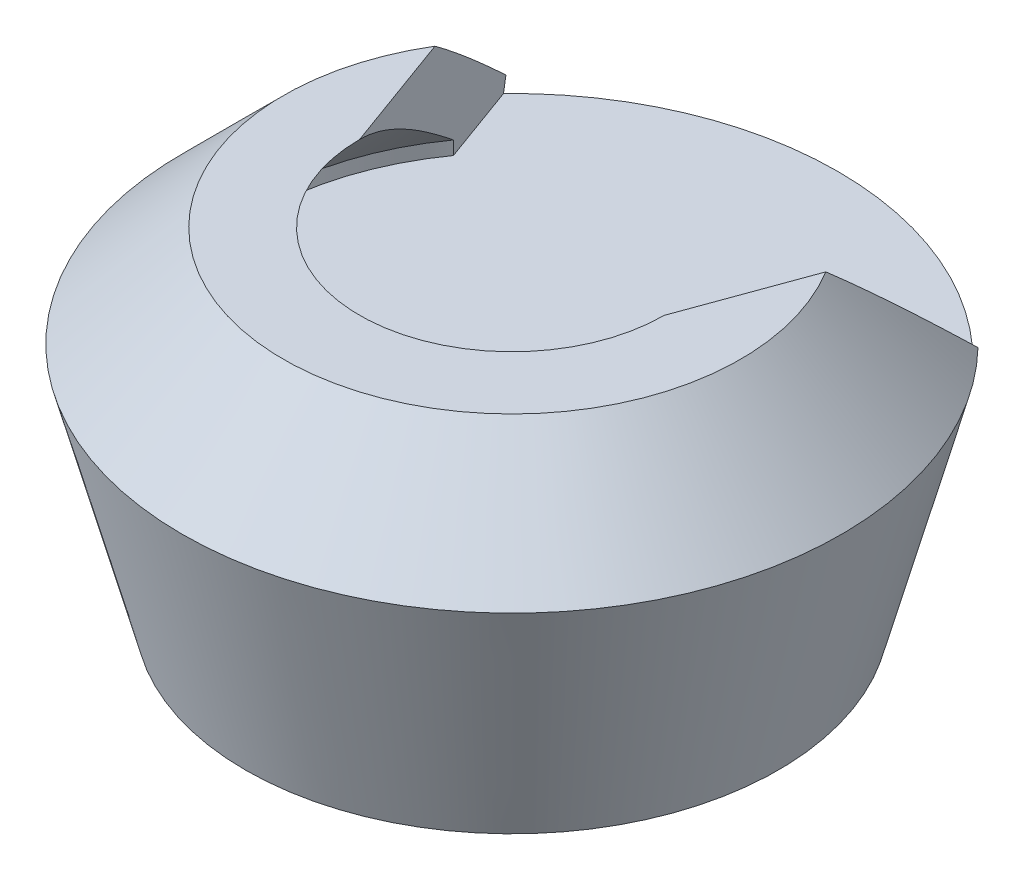
ISO-10303-21;
HEADER;
FILE_DESCRIPTION(('STEP AP214'),'2;1');
FILE_NAME('part.step','',(''),(''),'','','');
FILE_SCHEMA(('AUTOMOTIVE_DESIGN { 1 0 10303 214 1 1 1 1 }'));
ENDSEC;
DATA;
#1=APPLICATION_CONTEXT('core data for automotive mechanical design processes');
#2=APPLICATION_PROTOCOL_DEFINITION('international standard','automotive_design',2000,#1);
#3=PRODUCT_CONTEXT('',#1,'mechanical');
#4=PRODUCT('Part','Part','',(#3));
#5=PRODUCT_RELATED_PRODUCT_CATEGORY('part','',(#4));
#6=PRODUCT_DEFINITION_FORMATION('','',#4);
#7=PRODUCT_DEFINITION_CONTEXT('part definition',#1,'design');
#8=PRODUCT_DEFINITION('design','',#6,#7);
#9=PRODUCT_DEFINITION_SHAPE('','',#8);
#10=(LENGTH_UNIT() NAMED_UNIT(*) SI_UNIT(.MILLI.,.METRE.));
#11=(NAMED_UNIT(*) PLANE_ANGLE_UNIT() SI_UNIT($,.RADIAN.));
#12=(NAMED_UNIT(*) SI_UNIT($,.STERADIAN.) SOLID_ANGLE_UNIT());
#13=UNCERTAINTY_MEASURE_WITH_UNIT(LENGTH_MEASURE(1.E-05),#10,'distance_accuracy_value','');
#14=(GEOMETRIC_REPRESENTATION_CONTEXT(3) GLOBAL_UNCERTAINTY_ASSIGNED_CONTEXT((#13)) GLOBAL_UNIT_ASSIGNED_CONTEXT((#10,
#11,#12)) REPRESENTATION_CONTEXT('',''));
#15=CARTESIAN_POINT('',(0.,0.,0.));
#16=DIRECTION('',(0.,0.,1.));
#17=DIRECTION('',(1.,0.,0.));
#18=AXIS2_PLACEMENT_3D('',#15,#16,#17);
#19=CARTESIAN_POINT('',(0.,3.81,0.));
#20=DIRECTION('',(0.,-1.,0.));
#21=DIRECTION('',(0.,0.,-1.));
#22=AXIS2_PLACEMENT_3D('',#19,#20,#21);
#23=CONICAL_SURFACE('',#22,5.74310768363208,0.785398163397447);
#24=CARTESIAN_POINT('',(-5.07103692629219,4.1563517215325,1.84649923006714));
#25=CARTESIAN_POINT('',(-5.09942813403995,4.15636987535685,1.76849502786911));
#26=CARTESIAN_POINT('',(-5.12781520747056,4.15445844003045,1.6905021846141));
#27=CARTESIAN_POINT('',(-5.18452515781636,4.14683920483627,1.53469287658062));
#28=CARTESIAN_POINT('',(-5.21284804452437,4.14113202956779,1.45687638489659));
#29=CARTESIAN_POINT('',(-5.29752377616605,4.118444100905,1.22423172423527));
#30=CARTESIAN_POINT('',(-5.35371148968121,4.09589642801169,1.06985725010159));
#31=CARTESIAN_POINT('',(-5.46422625125094,4.03767333012167,0.766220438172343));
#32=CARTESIAN_POINT('',(-5.51856860477442,4.00223986881752,0.616916048946578));
#33=CARTESIAN_POINT('',(-5.6262301947838,3.91977017981424,0.321118261453221));
#34=CARTESIAN_POINT('',(-5.67954892688941,3.87272838273564,0.174626248959096));
#35=CARTESIAN_POINT('',(-5.79007504052495,3.76378096106607,-0.129041752514604));
#36=CARTESIAN_POINT('',(-5.84716712879035,3.70088452020621,-0.285900975853314));
#37=CARTESIAN_POINT('',(-5.95997917297087,3.5653060278229,-0.595849519881816));
#38=CARTESIAN_POINT('',(-6.01569873781323,3.49262122459699,-0.748937766108026));
#39=CARTESIAN_POINT('',(-6.12591950574524,3.33917234025982,-1.05176683715616));
#40=CARTESIAN_POINT('',(-6.18041863631643,3.25839562802015,-1.20150196778042));
#41=CARTESIAN_POINT('',(-6.28822084034817,3.09036754204224,-1.49768608912508));
#42=CARTESIAN_POINT('',(-6.34152405408519,3.00311693289307,-1.64413546525189));
#43=CARTESIAN_POINT('',(-6.44797403621707,2.82179749068653,-1.93660438746059));
#44=CARTESIAN_POINT('',(-6.50110259240164,2.72763767475639,-2.08257389590591));
#45=CARTESIAN_POINT('',(-6.60640358838151,2.53484512920681,-2.37188600460668));
#46=CARTESIAN_POINT('',(-6.65857595407911,2.43621205498353,-2.51522840128038));
#47=CARTESIAN_POINT('',(-6.76203700847405,2.23535631074949,-2.79948531202344));
#48=CARTESIAN_POINT('',(-6.81332643850043,2.13313689543744,-2.94040186287762));
#49=CARTESIAN_POINT('',(-6.91517805082503,1.92564330551694,-3.22023686787449));
#50=CARTESIAN_POINT('',(-6.96574020754411,1.82036902385598,-3.35915525173909));
#51=CARTESIAN_POINT('',(-7.08103177471667,1.57587697685212,-3.67591622919924));
#52=CARTESIAN_POINT('',(-7.1455467806354,1.43579582279267,-3.85316975117694));
#53=CARTESIAN_POINT('',(-7.27368364935058,1.15219026930894,-4.2052229045715));
#54=CARTESIAN_POINT('',(-7.33730550228478,1.00866583191106,-4.38002250889208));
#55=CARTESIAN_POINT('',(-7.46238692552022,0.722040728198596,-4.72368089482471));
#56=CARTESIAN_POINT('',(-7.52386309261175,0.579001839643264,-4.89258527574329));
#57=CARTESIAN_POINT('',(-7.64618612657494,0.290708889923267,-5.22866504943633));
#58=CARTESIAN_POINT('',(-7.70703311019506,0.145455252560808,-5.39584076297453));
#59=CARTESIAN_POINT('',(-7.76762257369396,-0.000699999999998335,-5.56230894579465));
#60=B_SPLINE_CURVE_WITH_KNOTS('',3,(#24,#25,#26,#27,#28,#29,#30,#31,#32,#33,#34,#35,#36,#37,#38,
#39,#40,#41,#42,#43,#44,#45,#46,#47,#48,#49,#50,#51,#52,#53,#54,#55,#56,#57,#58,#59),
.UNSPECIFIED.,.F.,.F.,(4,2,2,2,2,2,2,2,2,2,2,2,2,2,2,2,2,4),(0.,0.248985136458512,
0.49792931187136,0.994700929915593,1.48258916194823,1.97071192680393,2.50547979698101,
3.04039831604319,3.57616523119277,4.11186897087043,4.65671986661515,5.20161280726033,
5.74602342290091,6.29045313956591,6.99526593985006,7.70008651660314,8.38920675073795,
9.07819673352875),.UNSPECIFIED.);
#61=CARTESIAN_POINT('',(-5.74310768363208,3.81,0.));
#62=VERTEX_POINT('',#61);
#63=CARTESIAN_POINT('',(-7.76733243064064,0.,-5.56151178430724));
#64=VERTEX_POINT('',#63);
#65=EDGE_CURVE('E61',#62,#64,#60,.T.);
#66=ORIENTED_EDGE('',*,*,#65,.F.);
#67=CARTESIAN_POINT('',(0.,3.81,0.));
#68=DIRECTION('',(0.,-1.,0.));
#69=DIRECTION('',(0.,0.,-1.));
#70=AXIS2_PLACEMENT_3D('',#67,#68,#69);
#71=CIRCLE('',#70,5.74310768363208);
#72=CARTESIAN_POINT('',(5.74310768363208,3.81,0.));
#73=VERTEX_POINT('',#72);
#74=EDGE_CURVE('E11',#73,#62,#71,.T.);
#75=ORIENTED_EDGE('',*,*,#74,.F.);
#76=CARTESIAN_POINT('',(7.76762257369396,-0.000700000000000264,-5.56230894579465));
#77=CARTESIAN_POINT('',(7.71856681022951,0.117643676836092,-5.42752934338196));
#78=CARTESIAN_POINT('',(7.66934068161263,0.235387952292131,-5.29228166655993));
#79=CARTESIAN_POINT('',(7.57049301476131,0.469465493199715,-5.02069993392014));
#80=CARTESIAN_POINT('',(7.52087145381213,0.58579867661192,-4.88436581569418));
#81=CARTESIAN_POINT('',(7.42111056186508,0.816998062347882,-4.61027501772501));
#82=CARTESIAN_POINT('',(7.3709705764071,0.931861854074,-4.47251653986743));
#83=CARTESIAN_POINT('',(7.27018227597654,1.1596641973228,-4.19560296028925));
#84=CARTESIAN_POINT('',(7.219533969244,1.2726027799739,-4.056447881208));
#85=CARTESIAN_POINT('',(7.11581520130648,1.50025030571993,-3.771482908326));
#86=CARTESIAN_POINT('',(7.06272331114254,1.61487594802378,-3.6256141389444));
#87=CARTESIAN_POINT('',(6.95581829740996,1.84121345699558,-3.33189502768765));
#88=CARTESIAN_POINT('',(6.90200519078045,1.95292539191657,-3.18404473235239));
#89=CARTESIAN_POINT('',(6.79357089274452,2.17277756561151,-2.88612394700425));
#90=CARTESIAN_POINT('',(6.73895013487403,2.28091962658404,-2.73605464812158));
#91=CARTESIAN_POINT('',(6.62874583950862,2.49291207245634,-2.43327083507822));
#92=CARTESIAN_POINT('',(6.57316236804452,2.59676275005321,-2.2805565023357));
#93=CARTESIAN_POINT('',(6.44923725120714,2.82019072990996,-1.94007504212171));
#94=CARTESIAN_POINT('',(6.38063978128559,2.93856445220774,-1.75160504248053));
#95=CARTESIAN_POINT('',(6.24151179718698,3.16537818640374,-1.36935404775537));
#96=CARTESIAN_POINT('',(6.17098085433578,3.27381597186157,-1.17557187489886));
#97=CARTESIAN_POINT('',(6.0286943861149,3.47624657988181,-0.784643016368038));
#98=CARTESIAN_POINT('',(5.95696846938302,3.57041546383014,-0.58757767975751));
#99=CARTESIAN_POINT('',(5.81122070262597,3.74213795334608,-0.187138981656595));
#100=CARTESIAN_POINT('',(5.73720016214505,3.81970084316714,0.0162307818905612));
#101=CARTESIAN_POINT('',(5.6145838232576,3.92898455544991,0.353116404240037));
#102=CARTESIAN_POINT('',(5.5666513603291,3.96707312887542,0.484809763794928));
#103=CARTESIAN_POINT('',(5.47001884988636,4.03357612081015,0.750305404221583));
#104=CARTESIAN_POINT('',(5.42131911189537,4.06199434088126,0.884106834685185));
#105=CARTESIAN_POINT('',(5.32256250661768,4.10846623059418,1.15543837770762));
#106=CARTESIAN_POINT('',(5.27249628718579,4.12635370336416,1.29299418507419));
#107=CARTESIAN_POINT('',(5.19712343934275,4.14432357757604,1.50007938256293));
#108=CARTESIAN_POINT('',(5.17193342998384,4.14883670080695,1.5692883644724));
#109=CARTESIAN_POINT('',(5.12150887833859,4.15485809549427,1.70782868150385));
#110=CARTESIAN_POINT('',(5.09627433167398,4.1563660529196,1.77716002865505));
#111=CARTESIAN_POINT('',(5.07103692629219,4.1563517215325,1.84649923006714));
#112=B_SPLINE_CURVE_WITH_KNOTS('',3,(#76,#77,#78,#79,#80,#81,#82,#83,#84,#85,#86,#87,#88,#89,
#90,#91,#92,#93,#94,#95,#96,#97,#98,#99,#100,#101,#102,#103,#104,#105,#106,#107,#108,#109,#110,
#111),.UNSPECIFIED.,.F.,.F.,(4,2,2,2,2,2,2,2,2,2,2,2,2,2,2,2,2,4),(0.,0.557851081076562,
1.11573444102931,1.67443873784713,2.23313399247535,2.81200060596816,3.39085364742088,
3.96940650214616,4.54791983087647,5.24637810530358,5.94499250914945,6.63412601675453,
7.32287322437147,7.75826858224512,8.19349258136192,8.63541295560263,8.85672540082296,
9.07806097133646),.UNSPECIFIED.);
#113=CARTESIAN_POINT('',(7.76733243064064,0.,-5.56151178430724));
#114=VERTEX_POINT('',#113);
#115=EDGE_CURVE('E92',#114,#73,#112,.T.);
#116=ORIENTED_EDGE('',*,*,#115,.F.);
#117=CARTESIAN_POINT('',(0.,0.,0.));
#118=DIRECTION('',(0.,1.,0.));
#119=DIRECTION('',(0.,0.,1.));
#120=AXIS2_PLACEMENT_3D('',#117,#118,#119);
#121=CIRCLE('',#120,9.55310768363207);
#122=EDGE_CURVE('E112',#64,#114,#121,.T.);
#123=ORIENTED_EDGE('',*,*,#122,.F.);
#124=EDGE_LOOP('',(#66,#75,#116,#123));
#125=FACE_BOUND('',#124,.T.);
#126=ADVANCED_FACE('F39',(#125),#23,.F.);
#127=CARTESIAN_POINT('',(5.74310768363208,3.81,0.));
#128=DIRECTION('',(0.,1.,0.));
#129=DIRECTION('',(0.,0.,1.));
#130=AXIS2_PLACEMENT_3D('',#127,#128,#129);
#131=PLANE('',#130);
#132=DIRECTION('',(0.342020143325669,0.,0.939692620785908));
#133=VECTOR('',#132,1.);
#134=CARTESIAN_POINT('',(-5.74310768363208,3.81,0.));
#135=LINE('',#134,#133);
#136=CARTESIAN_POINT('',(-7.3687937685641,3.81,-4.4665358094723));
#137=VERTEX_POINT('',#136);
#138=EDGE_CURVE('E110',#137,#62,#135,.T.);
#139=ORIENTED_EDGE('',*,*,#138,.F.);
#140=CARTESIAN_POINT('',(0.,3.81,0.));
#141=DIRECTION('',(0.,-1.,0.));
#142=DIRECTION('',(0.,0.,-1.));
#143=AXIS2_PLACEMENT_3D('',#140,#141,#142);
#144=CIRCLE('',#143,8.61678964237421);
#145=CARTESIAN_POINT('',(7.3687937685641,3.81,-4.4665358094723));
#146=VERTEX_POINT('',#145);
#147=EDGE_CURVE('E47',#146,#137,#144,.T.);
#148=ORIENTED_EDGE('',*,*,#147,.F.);
#149=DIRECTION('',(0.342020143325669,0.,-0.939692620785908));
#150=VECTOR('',#149,1.);
#151=CARTESIAN_POINT('',(5.74310768363208,3.81,0.));
#152=LINE('',#151,#150);
#153=EDGE_CURVE('E95',#73,#146,#152,.T.);
#154=ORIENTED_EDGE('',*,*,#153,.F.);
#155=ORIENTED_EDGE('',*,*,#74,.T.);
#156=EDGE_LOOP('',(#139,#148,#154,#155));
#157=FACE_BOUND('',#156,.T.);
#158=ADVANCED_FACE('F108',(#157),#131,.T.);
#159=CARTESIAN_POINT('',(0.,0.,0.));
#160=DIRECTION('',(0.,-1.,0.));
#161=DIRECTION('',(0.,0.,-1.));
#162=AXIS2_PLACEMENT_3D('',#159,#160,#161);
#163=CONICAL_SURFACE('',#162,12.4267896423742,0.785398163397447);
#164=CARTESIAN_POINT('',(-8.90003579911093,-0.000671014270985767,-8.67358871211955));
#165=CARTESIAN_POINT('',(-8.83216028495689,0.178083478260442,-8.48710226964745));
#166=CARTESIAN_POINT('',(-8.76413553757406,0.35635578245481,-8.30020581224901));
#167=CARTESIAN_POINT('',(-8.6277327070048,0.711750378971485,-7.92544211531029));
#168=CARTESIAN_POINT('',(-8.55935461536759,0.888872643558002,-7.73757485255164));
#169=CARTESIAN_POINT('',(-8.4221468041357,1.24189301836332,-7.36059948941923));
#170=CARTESIAN_POINT('',(-8.35331680881792,1.41779021329921,-7.17149063150246));
#171=CARTESIAN_POINT('',(-8.21518407963337,1.76798880559587,-6.79197407718027));
#172=CARTESIAN_POINT('',(-8.14588134932103,1.94229021493212,-6.60156639054056));
#173=CARTESIAN_POINT('',(-8.00602322372494,2.29072663007981,-6.21730934853807));
#174=CARTESIAN_POINT('',(-7.93546223489326,2.46484246501746,-6.02344462502865));
#175=CARTESIAN_POINT('',(-7.79366958029457,2.8107228651536,-5.6338725082742));
#176=CARTESIAN_POINT('',(-7.72243792111138,2.98248745339326,-5.4381651331181));
#177=CARTESIAN_POINT('',(-7.5791917089828,3.323094052748,-5.04459939987243));
#178=CARTESIAN_POINT('',(-7.50717736899602,3.4919368279727,-4.84674162688181));
#179=CARTESIAN_POINT('',(-7.3621856999805,3.82604296517317,-4.44838029025265));
#180=CARTESIAN_POINT('',(-7.28920840196969,3.99130644199126,-4.24787681183512));
#181=CARTESIAN_POINT('',(-7.13151157547767,4.34075925380944,-3.81460834192865));
#182=CARTESIAN_POINT('',(-7.04661161868425,4.52425568288417,-3.58134762772607));
#183=CARTESIAN_POINT('',(-6.87486611858396,4.88345921448667,-3.10948074430756));
#184=CARTESIAN_POINT('',(-6.78802017053639,5.05916467352774,-2.87087346307575));
#185=CARTESIAN_POINT('',(-6.61189307570443,5.39988181377549,-2.3869682470708));
#186=CARTESIAN_POINT('',(-6.52261195922314,5.5648936279671,-2.14167039555475));
#187=CARTESIAN_POINT('',(-6.34100815548002,5.8799452835993,-1.64271804548346));
#188=CARTESIAN_POINT('',(-6.2486868152252,6.02999164003784,-1.38906724779957));
#189=CARTESIAN_POINT('',(-6.09365528349199,6.25939168151418,-0.963121615059105));
#190=CARTESIAN_POINT('',(-6.0320278415242,6.34497158190437,-0.793801609833839));
#191=CARTESIAN_POINT('',(-5.90705328995342,6.50486713561259,-0.450436851386652));
#192=CARTESIAN_POINT('',(-5.84370589332319,6.57918089503602,-0.276391309563876));
#193=CARTESIAN_POINT('',(-5.71562660260358,6.71332048621825,0.0755036495880284));
#194=CARTESIAN_POINT('',(-5.65090468631652,6.77322666599113,0.253325653130543));
#195=CARTESIAN_POINT('',(-5.51991980973506,6.87596986892309,0.613203643828153));
#196=CARTESIAN_POINT('',(-5.45365818394933,6.91882112992646,0.795255964450813));
#197=CARTESIAN_POINT('',(-5.33480387397768,6.97737640830699,1.12180549730277));
#198=CARTESIAN_POINT('',(-5.28243843754717,6.99699322434161,1.26567835145549));
#199=CARTESIAN_POINT('',(-5.20348249133391,7.0167594493563,1.4826080308081));
#200=CARTESIAN_POINT('',(-5.17702697515653,7.0217386139259,1.55529396412546));
#201=CARTESIAN_POINT('',(-5.12406092173654,7.02838425802413,1.7008169998945));
#202=CARTESIAN_POINT('',(-5.09755037259258,7.03004992492169,1.77365413504489));
#203=CARTESIAN_POINT('',(-5.07103692629219,7.03003368027463,1.84649923006714));
#204=B_SPLINE_CURVE_WITH_KNOTS('',3,(#164,#165,#166,#167,#168,#169,#170,#171,#172,#173,#174,
#175,#176,#177,#178,#179,#180,#181,#182,#183,#184,#185,#186,#187,#188,#189,#190,#191,#192,#193,
#194,#195,#196,#197,#198,#199,#200,#201,#202,#203),.UNSPECIFIED.,.F.,.F.,(4,2,2,2,2,2,2,2,2,2,2,
2,2,2,2,2,2,2,2,4),(0.,0.801273556807875,1.60256636687996,2.40440457923474,3.20623676930671,
4.01610410215596,4.82596349297669,5.63560778800631,6.44522606687951,7.37118400385223,
8.29733634913575,9.22347717468491,10.1492130419672,10.7473483590932,11.3455841145262,
11.9404019752507,12.5347222213022,12.9972501193852,13.2297187647348,13.4622444156972),.UNSPECIFIED.);
#205=CARTESIAN_POINT('',(-8.89978101994695,0.,-8.67288871211955));
#206=VERTEX_POINT('',#205);
#207=EDGE_CURVE('E117',#206,#137,#204,.T.);
#208=ORIENTED_EDGE('',*,*,#207,.F.);
#209=CARTESIAN_POINT('',(0.,0.,0.));
#210=DIRECTION('',(0.,-1.,0.));
#211=DIRECTION('',(0.,0.,-1.));
#212=AXIS2_PLACEMENT_3D('',#209,#210,#211);
#213=CIRCLE('',#212,12.4267896423742);
#214=CARTESIAN_POINT('',(8.89978101994695,0.,-8.67288871211955));
#215=VERTEX_POINT('',#214);
#216=EDGE_CURVE('E184',#215,#206,#213,.T.);
#217=ORIENTED_EDGE('',*,*,#216,.F.);
#218=CARTESIAN_POINT('',(5.07103692629219,7.03003368027463,1.84649923006714));
#219=CARTESIAN_POINT('',(5.09944713626079,7.03005185815355,1.76844281969642));
#220=CARTESIAN_POINT('',(5.12785320076522,7.02813784651352,1.69039779889494));
#221=CARTESIAN_POINT('',(5.18460099350209,7.02050842255094,1.53448451974649));
#222=CARTESIAN_POINT('',(5.21294273158452,7.01479363805511,1.45661623433691));
#223=CARTESIAN_POINT('',(5.29767362610627,6.99207588313655,1.22382001490822));
#224=CARTESIAN_POINT('',(5.35389733837636,6.9694989889247,1.06934663500824));
#225=CARTESIAN_POINT('',(5.46440914758379,6.91124066812874,0.765717934627753));
#226=CARTESIAN_POINT('',(5.51871368533089,6.8758189638445,0.61651744339366));
#227=CARTESIAN_POINT('',(5.62630146396744,6.79338925268476,0.320922450980466));
#228=CARTESIAN_POINT('',(5.67958419215911,6.74637558537067,0.174529358426918));
#229=CARTESIAN_POINT('',(5.78986170946047,6.63767319781677,-0.128455630232089));
#230=CARTESIAN_POINT('',(5.84674552274328,6.57503081859634,-0.284742622759071));
#231=CARTESIAN_POINT('',(5.95915732542785,6.44001760706282,-0.593591512315135));
#232=CARTESIAN_POINT('',(6.01468477479756,6.36764297214828,-0.746151925618304));
#233=CARTESIAN_POINT('',(6.12451676428526,6.21487758339877,-1.04791283666954));
#234=CARTESIAN_POINT('',(6.17881954945859,6.13447612365186,-1.19710851274675));
#235=CARTESIAN_POINT('',(6.28625342503781,5.96720689502197,-1.49228065998518));
#236=CARTESIAN_POINT('',(6.33938428741165,5.88033788182547,-1.63825650463343));
#237=CARTESIAN_POINT('',(6.44584333995107,5.69921237613537,-1.93075034758204));
#238=CARTESIAN_POINT('',(6.49914624904036,5.60482943268603,-2.0771988866961));
#239=CARTESIAN_POINT('',(6.60478155247216,5.41156642115754,-2.36742949757221));
#240=CARTESIAN_POINT('',(6.65711400148271,5.31268660748644,-2.51121171953346));
#241=CARTESIAN_POINT('',(6.76095665278577,5.11118010670036,-2.79651705916492));
#242=CARTESIAN_POINT('',(6.81246650824389,5.00855189610744,-2.93803922391546));
#243=CARTESIAN_POINT('',(6.9147523591473,4.80021105699818,-3.21906728960228));
#244=CARTESIAN_POINT('',(6.96552832385892,4.69449829986447,-3.35857310609848));
#245=CARTESIAN_POINT('',(7.10129543513451,4.40659038432293,-3.73159017863276));
#246=CARTESIAN_POINT('',(7.1856934672691,4.22200477376611,-3.96347186616893));
#247=CARTESIAN_POINT('',(7.35301644656868,3.84735128797789,-4.42318797355042));
#248=CARTESIAN_POINT('',(7.43594170875888,3.65728460853417,-4.65102325892035));
#249=CARTESIAN_POINT('',(7.60068217489334,3.27274618375174,-5.1036439696952));
#250=CARTESIAN_POINT('',(7.68249655272297,3.07827141953035,-5.32842712536883));
#251=CARTESIAN_POINT('',(7.84517917824178,2.68595071457461,-5.77539396551935));
#252=CARTESIAN_POINT('',(7.9260473769103,2.48810460046673,-5.99757751531309));
#253=CARTESIAN_POINT('',(8.0821458795273,2.10174434495571,-6.42645462646398));
#254=CARTESIAN_POINT('',(8.15742186435997,1.9133877193719,-6.63327369501894));
#255=CARTESIAN_POINT('',(8.30739461757975,1.53472218222072,-7.04532044802373));
#256=CARTESIAN_POINT('',(8.38209139496448,1.34441330108748,-7.25054815719429));
#257=CARTESIAN_POINT('',(8.53090043801126,0.962419510278932,-7.65939764277597));
#258=CARTESIAN_POINT('',(8.60501333545414,0.770736702222386,-7.86302115499064));
#259=CARTESIAN_POINT('',(8.75282087111178,0.385999860003307,-8.26911902163525));
#260=CARTESIAN_POINT('',(8.82651551213749,0.192945835075867,-8.47159338378818));
#261=CARTESIAN_POINT('',(8.90003579911093,-0.000671014270981897,-8.67358871211955));
#262=B_SPLINE_CURVE_WITH_KNOTS('',3,(#218,#219,#220,#221,#222,#223,#224,#225,#226,#227,#228,
#229,#230,#231,#232,#233,#234,#235,#236,#237,#238,#239,#240,#241,#242,#243,#244,#245,#246,#247,
#248,#249,#250,#251,#252,#253,#254,#255,#256,#257,#258,#259,#260,#261),.UNSPECIFIED.,.F.,.F.,(4,
2,2,2,2,2,2,2,2,2,2,2,2,2,2,2,2,2,2,2,2,4),(0.,0.249151705572404,0.498262265497953,
0.995357233503712,1.48291535985563,1.97071203747497,2.50350589364833,3.03650853200878,
3.57023181808628,4.1040580555905,4.65056231842954,5.1970357014467,5.74373371719984,
6.29045456147429,7.21482637121789,8.13899801700068,9.06382294170669,9.98869557043982,
10.8577444706538,11.7267798435992,12.5946895790382,13.4625934746704),.UNSPECIFIED.);
#263=EDGE_CURVE('E119',#146,#215,#262,.T.);
#264=ORIENTED_EDGE('',*,*,#263,.F.);
#265=ORIENTED_EDGE('',*,*,#147,.T.);
#266=EDGE_LOOP('',(#208,#217,#264,#265));
#267=FACE_BOUND('',#266,.T.);
#268=ADVANCED_FACE('F150',(#267),#163,.T.);
#269=CARTESIAN_POINT('',(0.,0.,0.));
#270=DIRECTION('',(0.,1.,0.));
#271=DIRECTION('',(0.,0.,-1.));
#272=AXIS2_PLACEMENT_3D('',#269,#270,#271);
#273=CONICAL_SURFACE('',#272,12.4267896423742,0.26179938779915);
#274=ORIENTED_EDGE('',*,*,#216,.T.);
#275=CARTESIAN_POINT('',(-8.89980136773041,0.000200000000000743,-8.67294461719514));
#276=CARTESIAN_POINT('',(-8.89117985687663,-0.0845422994720249,-8.64925721080279));
#277=CARTESIAN_POINT('',(-8.88255319809887,-0.169280115867338,-8.62555566060556));
#278=CARTESIAN_POINT('',(-8.86528958469239,-0.338746782534011,-8.57812427259308));
#279=CARTESIAN_POINT('',(-8.85665263006367,-0.423475632805367,-8.55439443477782));
#280=CARTESIAN_POINT('',(-8.84801052751097,-0.508200000000008,-8.53065045315766));
#281=B_SPLINE_CURVE_WITH_KNOTS('',3,(#275,#276,#277,#278,#279,#280),.UNSPECIFIED.,.F.,.F.,(4,2,
4),(0.,0.265235974667448,0.530471949427146),.UNSPECIFIED.);
#282=CARTESIAN_POINT('',(-8.84803092819148,-0.508,-8.5307065035667));
#283=VERTEX_POINT('',#282);
#284=EDGE_CURVE('E113',#206,#283,#281,.T.);
#285=ORIENTED_EDGE('',*,*,#284,.T.);
#286=CARTESIAN_POINT('',(0.,-0.508,0.));
#287=DIRECTION('',(0.,1.,0.));
#288=DIRECTION('',(0.,0.,1.));
#289=AXIS2_PLACEMENT_3D('',#286,#287,#288);
#290=CIRCLE('',#289,12.2906714526192);
#291=CARTESIAN_POINT('',(8.84803092819148,-0.508,-8.5307065035667));
#292=VERTEX_POINT('',#291);
#293=EDGE_CURVE('E148',#292,#283,#290,.T.);
#294=ORIENTED_EDGE('',*,*,#293,.F.);
#295=CARTESIAN_POINT('',(8.84801052751097,-0.508200000000007,-8.53065045315766));
#296=CARTESIAN_POINT('',(8.85665263006367,-0.423475632805367,-8.55439443477782));
#297=CARTESIAN_POINT('',(8.86528958469239,-0.338746782534011,-8.57812427259308));
#298=CARTESIAN_POINT('',(8.88255319809887,-0.169280115867338,-8.62555566060556));
#299=CARTESIAN_POINT('',(8.89117985687662,-0.084542299472025,-8.64925721080279));
#300=CARTESIAN_POINT('',(8.89980136773041,0.000200000000001028,-8.67294461719514));
#301=B_SPLINE_CURVE_WITH_KNOTS('',3,(#295,#296,#297,#298,#299,#300),.UNSPECIFIED.,.F.,.F.,(4,2,
4),(0.,0.265235974759699,0.530471949427146),.UNSPECIFIED.);
#302=EDGE_CURVE('E103',#292,#215,#301,.T.);
#303=ORIENTED_EDGE('',*,*,#302,.T.);
#304=EDGE_LOOP('',(#274,#285,#294,#303));
#305=FACE_BOUND('',#304,.T.);
#306=CARTESIAN_POINT('',(0.,-8.89,0.));
#307=DIRECTION('',(0.,-1.,0.));
#308=DIRECTION('',(0.,0.,-1.));
#309=AXIS2_PLACEMENT_3D('',#306,#307,#308);
#310=CIRCLE('',#309,10.0447213216615);
#311=CARTESIAN_POINT('',(0.,-8.89,-10.0447213216615));
#312=VERTEX_POINT('',#311);
#313=EDGE_CURVE('E185',#312,#312,#310,.T.);
#314=ORIENTED_EDGE('',*,*,#313,.F.);
#315=EDGE_LOOP('',(#314));
#316=FACE_BOUND('',#315,.T.);
#317=ADVANCED_FACE('F153',(#305,#316),#273,.T.);
#318=CARTESIAN_POINT('',(0.,-8.89,0.));
#319=DIRECTION('',(0.,-1.,0.));
#320=DIRECTION('',(0.,0.,-1.));
#321=AXIS2_PLACEMENT_3D('',#318,#319,#320);
#322=PLANE('',#321);
#323=ORIENTED_EDGE('',*,*,#313,.T.);
#324=EDGE_LOOP('',(#323));
#325=FACE_BOUND('',#324,.T.);
#326=ADVANCED_FACE('F195',(#325),#322,.T.);
#327=CARTESIAN_POINT('',(0.,-0.508,0.));
#328=DIRECTION('',(0.,1.,0.));
#329=DIRECTION('',(0.,0.,1.));
#330=AXIS2_PLACEMENT_3D('',#327,#328,#329);
#331=CYLINDRICAL_SURFACE('',#330,9.55310768363207);
#332=CARTESIAN_POINT('',(0.,-0.508,0.));
#333=DIRECTION('',(0.,1.,0.));
#334=DIRECTION('',(0.,0.,1.));
#335=AXIS2_PLACEMENT_3D('',#332,#333,#334);
#336=CIRCLE('',#335,9.55310768363207);
#337=CARTESIAN_POINT('',(-7.76733243064064,-0.508,-5.56151178430724));
#338=VERTEX_POINT('',#337);
#339=CARTESIAN_POINT('',(7.76733243064064,-0.508000000000002,-5.56151178430724));
#340=VERTEX_POINT('',#339);
#341=EDGE_CURVE('E188',#338,#340,#336,.T.);
#342=ORIENTED_EDGE('',*,*,#341,.F.);
#343=DIRECTION('',(0.,1.,0.));
#344=VECTOR('',#343,1.);
#345=CARTESIAN_POINT('',(-7.76733243064064,-0.508,-5.56151178430724));
#346=LINE('',#345,#344);
#347=EDGE_CURVE('E114',#338,#64,#346,.T.);
#348=ORIENTED_EDGE('',*,*,#347,.T.);
#349=ORIENTED_EDGE('',*,*,#122,.T.);
#350=DIRECTION('',(0.,1.,0.));
#351=VECTOR('',#350,1.);
#352=CARTESIAN_POINT('',(7.76733243064064,-0.508,-5.56151178430724));
#353=LINE('',#352,#351);
#354=EDGE_CURVE('E98',#114,#340,#353,.F.);
#355=ORIENTED_EDGE('',*,*,#354,.T.);
#356=EDGE_LOOP('',(#342,#348,#349,#355));
#357=FACE_BOUND('',#356,.T.);
#358=ADVANCED_FACE('F193',(#357),#331,.F.);
#359=CARTESIAN_POINT('',(0.,-0.508,0.));
#360=DIRECTION('',(0.,1.,0.));
#361=DIRECTION('',(0.,0.,1.));
#362=AXIS2_PLACEMENT_3D('',#359,#360,#361);
#363=PLANE('',#362);
#364=ORIENTED_EDGE('',*,*,#341,.T.);
#365=DIRECTION('',(-0.342020143325669,0.,0.939692620785908));
#366=VECTOR('',#365,1.);
#367=CARTESIAN_POINT('',(5.74310768363208,-0.508000000000002,0.));
#368=LINE('',#367,#366);
#369=EDGE_CURVE('E174',#292,#340,#368,.T.);
#370=ORIENTED_EDGE('',*,*,#369,.F.);
#371=ORIENTED_EDGE('',*,*,#293,.T.);
#372=DIRECTION('',(-0.342020143325669,0.,-0.939692620785908));
#373=VECTOR('',#372,1.);
#374=CARTESIAN_POINT('',(-5.74310768363208,-0.508000000000002,0.));
#375=LINE('',#374,#373);
#376=EDGE_CURVE('E54',#338,#283,#375,.T.);
#377=ORIENTED_EDGE('',*,*,#376,.F.);
#378=EDGE_LOOP('',(#364,#370,#371,#377));
#379=FACE_BOUND('',#378,.T.);
#380=ADVANCED_FACE('F137',(#379),#363,.T.);
#381=CARTESIAN_POINT('',(-5.74310768363208,-22.2162820515086,0.));
#382=DIRECTION('',(-0.939692620785908,0.,0.342020143325669));
#383=DIRECTION('',(0.342020143325669,0.,0.939692620785908));
#384=AXIS2_PLACEMENT_3D('',#381,#382,#383);
#385=PLANE('',#384);
#386=ORIENTED_EDGE('',*,*,#207,.T.);
#387=ORIENTED_EDGE('',*,*,#138,.T.);
#388=ORIENTED_EDGE('',*,*,#65,.T.);
#389=ORIENTED_EDGE('',*,*,#347,.F.);
#390=ORIENTED_EDGE('',*,*,#376,.T.);
#391=ORIENTED_EDGE('',*,*,#284,.F.);
#392=EDGE_LOOP('',(#386,#387,#388,#389,#390,#391));
#393=FACE_BOUND('',#392,.T.);
#394=ADVANCED_FACE('F133',(#393),#385,.F.);
#395=CARTESIAN_POINT('',(5.74310768363208,-22.2162820515086,0.));
#396=DIRECTION('',(0.939692620785908,0.,0.342020143325669));
#397=DIRECTION('',(0.342020143325669,0.,-0.939692620785908));
#398=AXIS2_PLACEMENT_3D('',#395,#396,#397);
#399=PLANE('',#398);
#400=ORIENTED_EDGE('',*,*,#263,.T.);
#401=ORIENTED_EDGE('',*,*,#302,.F.);
#402=ORIENTED_EDGE('',*,*,#369,.T.);
#403=ORIENTED_EDGE('',*,*,#354,.F.);
#404=ORIENTED_EDGE('',*,*,#115,.T.);
#405=ORIENTED_EDGE('',*,*,#153,.T.);
#406=EDGE_LOOP('',(#400,#401,#402,#403,#404,#405));
#407=FACE_BOUND('',#406,.T.);
#408=ADVANCED_FACE('F94',(#407),#399,.F.);
#409=CLOSED_SHELL('',(#126,#158,#268,#317,#326,#358,#380,#394,#408));
#410=MANIFOLD_SOLID_BREP('B2',#409);
#411=ADVANCED_BREP_SHAPE_REPRESENTATION('',(#18,#410),#14);
#412=SHAPE_DEFINITION_REPRESENTATION(#9,#411);
ENDSEC;
END-ISO-10303-21;
